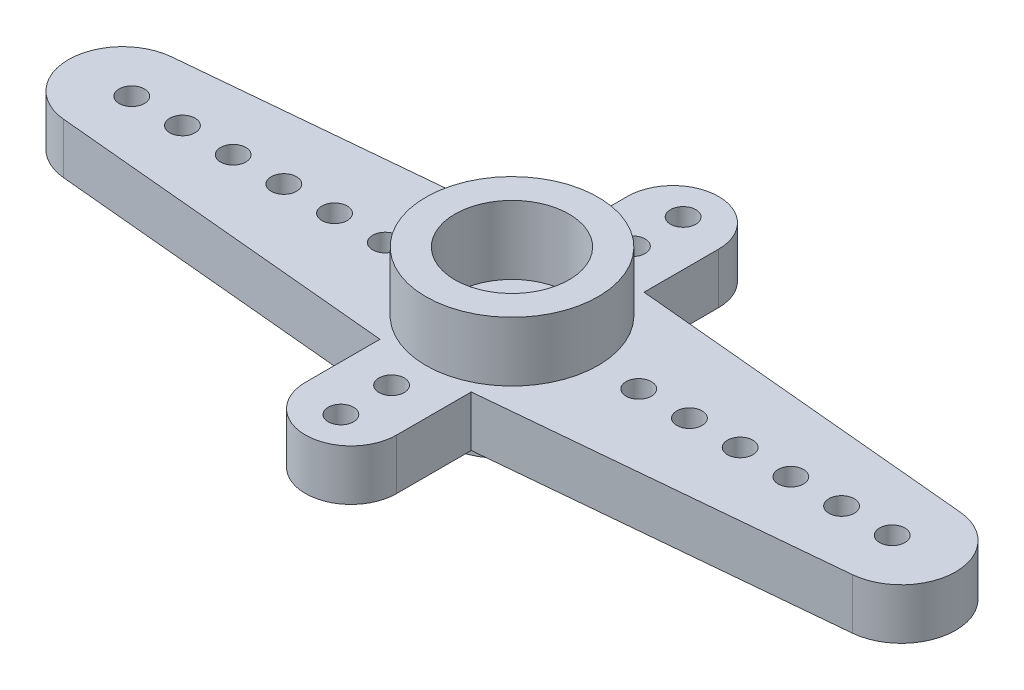
ISO-10303-21;
HEADER;
FILE_DESCRIPTION(('STEP AP214'),'2;1');
FILE_NAME('part.step','',(''),(''),'','','');
FILE_SCHEMA(('AUTOMOTIVE_DESIGN { 1 0 10303 214 1 1 1 1 }'));
ENDSEC;
DATA;
#1=APPLICATION_CONTEXT('core data for automotive mechanical design processes');
#2=APPLICATION_PROTOCOL_DEFINITION('international standard','automotive_design',2000,#1);
#3=PRODUCT_CONTEXT('',#1,'mechanical');
#4=PRODUCT('Part','Part','',(#3));
#5=PRODUCT_RELATED_PRODUCT_CATEGORY('part','',(#4));
#6=PRODUCT_DEFINITION_FORMATION('','',#4);
#7=PRODUCT_DEFINITION_CONTEXT('part definition',#1,'design');
#8=PRODUCT_DEFINITION('design','',#6,#7);
#9=PRODUCT_DEFINITION_SHAPE('','',#8);
#10=(LENGTH_UNIT() NAMED_UNIT(*) SI_UNIT(.MILLI.,.METRE.));
#11=(NAMED_UNIT(*) PLANE_ANGLE_UNIT() SI_UNIT($,.RADIAN.));
#12=(NAMED_UNIT(*) SI_UNIT($,.STERADIAN.) SOLID_ANGLE_UNIT());
#13=UNCERTAINTY_MEASURE_WITH_UNIT(LENGTH_MEASURE(1.E-05),#10,'distance_accuracy_value','');
#14=(GEOMETRIC_REPRESENTATION_CONTEXT(3) GLOBAL_UNCERTAINTY_ASSIGNED_CONTEXT((#13)) GLOBAL_UNIT_ASSIGNED_CONTEXT((#10,
#11,#12)) REPRESENTATION_CONTEXT('',''));
#15=CARTESIAN_POINT('',(0.,0.,0.));
#16=DIRECTION('',(0.,0.,1.));
#17=DIRECTION('',(1.,0.,0.));
#18=AXIS2_PLACEMENT_3D('',#15,#16,#17);
#19=CARTESIAN_POINT('',(0.,4.85,0.));
#20=DIRECTION('',(0.,-1.,0.));
#21=DIRECTION('',(0.,0.,-1.));
#22=AXIS2_PLACEMENT_3D('',#19,#20,#21);
#23=CYLINDRICAL_SURFACE('',#22,2.25);
#24=CARTESIAN_POINT('',(0.,0.,0.));
#25=DIRECTION('',(0.,1.,0.));
#26=DIRECTION('',(0.,0.,1.));
#27=AXIS2_PLACEMENT_3D('',#24,#25,#26);
#28=CIRCLE('',#27,2.25);
#29=CARTESIAN_POINT('',(0.,0.,2.25));
#30=VERTEX_POINT('',#29);
#31=EDGE_CURVE('E213',#30,#30,#28,.T.);
#32=ORIENTED_EDGE('',*,*,#31,.F.);
#33=EDGE_LOOP('',(#32));
#34=FACE_BOUND('',#33,.T.);
#35=CARTESIAN_POINT('',(0.,1.25,0.));
#36=DIRECTION('',(0.,1.,0.));
#37=DIRECTION('',(0.,0.,1.));
#38=AXIS2_PLACEMENT_3D('',#35,#36,#37);
#39=CIRCLE('',#38,2.25);
#40=CARTESIAN_POINT('',(0.,1.25,2.25));
#41=VERTEX_POINT('',#40);
#42=EDGE_CURVE('E239',#41,#41,#39,.T.);
#43=ORIENTED_EDGE('',*,*,#42,.T.);
#44=EDGE_LOOP('',(#43));
#45=FACE_BOUND('',#44,.T.);
#46=ADVANCED_FACE('F34',(#34,#45),#23,.F.);
#47=CARTESIAN_POINT('',(0.,4.85,0.));
#48=DIRECTION('',(0.,-1.,0.));
#49=DIRECTION('',(0.,0.,-1.));
#50=AXIS2_PLACEMENT_3D('',#47,#48,#49);
#51=CYLINDRICAL_SURFACE('',#50,3.4);
#52=CARTESIAN_POINT('',(0.,0.,0.));
#53=DIRECTION('',(0.,1.,0.));
#54=DIRECTION('',(0.,0.,1.));
#55=AXIS2_PLACEMENT_3D('',#52,#53,#54);
#56=CIRCLE('',#55,3.4);
#57=CARTESIAN_POINT('',(0.,0.,3.4));
#58=VERTEX_POINT('',#57);
#59=EDGE_CURVE('E217',#58,#58,#56,.T.);
#60=ORIENTED_EDGE('',*,*,#59,.T.);
#61=EDGE_LOOP('',(#60));
#62=FACE_BOUND('',#61,.T.);
#63=CARTESIAN_POINT('',(0.,0.5,0.));
#64=DIRECTION('',(0.,1.,0.));
#65=DIRECTION('',(0.,0.,1.));
#66=AXIS2_PLACEMENT_3D('',#63,#64,#65);
#67=CIRCLE('',#66,3.4);
#68=CARTESIAN_POINT('',(0.,0.5,3.4));
#69=VERTEX_POINT('',#68);
#70=EDGE_CURVE('E43',#69,#69,#67,.T.);
#71=ORIENTED_EDGE('',*,*,#70,.F.);
#72=EDGE_LOOP('',(#71));
#73=FACE_BOUND('',#72,.T.);
#74=ADVANCED_FACE('F224',(#62,#73),#51,.T.);
#75=CARTESIAN_POINT('',(0.,4.85,0.));
#76=DIRECTION('',(0.,1.,0.));
#77=DIRECTION('',(0.,0.,1.));
#78=AXIS2_PLACEMENT_3D('',#75,#76,#77);
#79=PLANE('',#78);
#80=CARTESIAN_POINT('',(0.,4.85,0.));
#81=DIRECTION('',(0.,1.,0.));
#82=DIRECTION('',(0.,0.,1.));
#83=AXIS2_PLACEMENT_3D('',#80,#81,#82);
#84=CIRCLE('',#83,3.4);
#85=CARTESIAN_POINT('',(0.,4.85,3.4));
#86=VERTEX_POINT('',#85);
#87=EDGE_CURVE('E210',#86,#86,#84,.T.);
#88=ORIENTED_EDGE('',*,*,#87,.T.);
#89=EDGE_LOOP('',(#88));
#90=FACE_BOUND('',#89,.T.);
#91=CARTESIAN_POINT('',(0.,4.85,0.));
#92=DIRECTION('',(0.,1.,0.));
#93=DIRECTION('',(0.,0.,1.));
#94=AXIS2_PLACEMENT_3D('',#91,#92,#93);
#95=CIRCLE('',#94,2.25);
#96=CARTESIAN_POINT('',(0.,4.85,2.25));
#97=VERTEX_POINT('',#96);
#98=EDGE_CURVE('E214',#97,#97,#95,.T.);
#99=ORIENTED_EDGE('',*,*,#98,.F.);
#100=EDGE_LOOP('',(#99));
#101=FACE_BOUND('',#100,.T.);
#102=ADVANCED_FACE('F230',(#90,#101),#79,.T.);
#103=CARTESIAN_POINT('',(0.,0.,0.));
#104=DIRECTION('',(0.,1.,0.));
#105=DIRECTION('',(0.,0.,1.));
#106=AXIS2_PLACEMENT_3D('',#103,#104,#105);
#107=PLANE('',#106);
#108=ORIENTED_EDGE('',*,*,#59,.F.);
#109=EDGE_LOOP('',(#108));
#110=FACE_BOUND('',#109,.T.);
#111=ORIENTED_EDGE('',*,*,#31,.T.);
#112=EDGE_LOOP('',(#111));
#113=FACE_BOUND('',#112,.T.);
#114=ADVANCED_FACE('F227',(#110,#113),#107,.F.);
#115=CARTESIAN_POINT('',(0.,2.5,0.));
#116=DIRECTION('',(0.,1.,0.));
#117=DIRECTION('',(0.,0.,1.));
#118=AXIS2_PLACEMENT_3D('',#115,#116,#117);
#119=CIRCLE('',#118,3.4);
#120=CARTESIAN_POINT('',(0.,2.5,3.4));
#121=VERTEX_POINT('',#120);
#122=EDGE_CURVE('E207',#121,#121,#119,.T.);
#123=ORIENTED_EDGE('',*,*,#122,.T.);
#124=EDGE_LOOP('',(#123));
#125=FACE_BOUND('',#124,.T.);
#126=ORIENTED_EDGE('',*,*,#87,.F.);
#127=EDGE_LOOP('',(#126));
#128=FACE_BOUND('',#127,.T.);
#129=ADVANCED_FACE('F36',(#125,#128),#51,.T.);
#130=CARTESIAN_POINT('',(0.,2.15,0.));
#131=DIRECTION('',(0.,1.,0.));
#132=DIRECTION('',(0.,0.,1.));
#133=AXIS2_PLACEMENT_3D('',#130,#131,#132);
#134=CIRCLE('',#133,2.25);
#135=CARTESIAN_POINT('',(0.,2.15,2.25));
#136=VERTEX_POINT('',#135);
#137=EDGE_CURVE('E11',#136,#136,#134,.T.);
#138=ORIENTED_EDGE('',*,*,#137,.F.);
#139=EDGE_LOOP('',(#138));
#140=FACE_BOUND('',#139,.T.);
#141=ORIENTED_EDGE('',*,*,#98,.T.);
#142=EDGE_LOOP('',(#141));
#143=FACE_BOUND('',#142,.T.);
#144=ADVANCED_FACE('F236',(#140,#143),#23,.F.);
#145=CARTESIAN_POINT('',(-1.22162409223594E-11,2.5,-6.35));
#146=DIRECTION('',(0.,1.,0.));
#147=DIRECTION('',(0.,0.,1.));
#148=AXIS2_PLACEMENT_3D('',#145,#146,#147);
#149=PLANE('',#148);
#150=CARTESIAN_POINT('',(-15.,2.5,0.));
#151=DIRECTION('',(0.,1.,0.));
#152=DIRECTION('',(0.,0.,1.));
#153=AXIS2_PLACEMENT_3D('',#150,#151,#152);
#154=CIRCLE('',#153,0.500000000000001);
#155=CARTESIAN_POINT('',(-15.,2.5,0.500000000000001));
#156=VERTEX_POINT('',#155);
#157=EDGE_CURVE('E245',#156,#156,#154,.T.);
#158=ORIENTED_EDGE('',*,*,#157,.F.);
#159=EDGE_LOOP('',(#158));
#160=FACE_BOUND('',#159,.T.);
#161=CARTESIAN_POINT('',(-11.,2.5,0.));
#162=DIRECTION('',(0.,1.,0.));
#163=DIRECTION('',(0.,0.,1.));
#164=AXIS2_PLACEMENT_3D('',#161,#162,#163);
#165=CIRCLE('',#164,0.500000000000001);
#166=CARTESIAN_POINT('',(-11.,2.5,0.500000000000001));
#167=VERTEX_POINT('',#166);
#168=EDGE_CURVE('E261',#167,#167,#165,.T.);
#169=ORIENTED_EDGE('',*,*,#168,.F.);
#170=EDGE_LOOP('',(#169));
#171=FACE_BOUND('',#170,.T.);
#172=CARTESIAN_POINT('',(-7.,2.5,0.));
#173=DIRECTION('',(0.,1.,0.));
#174=DIRECTION('',(0.,0.,1.));
#175=AXIS2_PLACEMENT_3D('',#172,#173,#174);
#176=CIRCLE('',#175,0.5);
#177=CARTESIAN_POINT('',(-7.,2.5,0.5));
#178=VERTEX_POINT('',#177);
#179=EDGE_CURVE('E273',#178,#178,#176,.T.);
#180=ORIENTED_EDGE('',*,*,#179,.F.);
#181=EDGE_LOOP('',(#180));
#182=FACE_BOUND('',#181,.T.);
#183=CARTESIAN_POINT('',(0.,2.5,-4.75));
#184=DIRECTION('',(0.,1.,0.));
#185=DIRECTION('',(0.,0.,1.));
#186=AXIS2_PLACEMENT_3D('',#183,#184,#185);
#187=CIRCLE('',#186,0.500000000000001);
#188=CARTESIAN_POINT('',(0.,2.5,-4.25));
#189=VERTEX_POINT('',#188);
#190=EDGE_CURVE('E285',#189,#189,#187,.T.);
#191=ORIENTED_EDGE('',*,*,#190,.F.);
#192=EDGE_LOOP('',(#191));
#193=FACE_BOUND('',#192,.T.);
#194=CARTESIAN_POINT('',(5.,2.5,0.));
#195=DIRECTION('',(0.,1.,0.));
#196=DIRECTION('',(0.,0.,1.));
#197=AXIS2_PLACEMENT_3D('',#194,#195,#196);
#198=CIRCLE('',#197,0.5);
#199=CARTESIAN_POINT('',(5.,2.5,0.5));
#200=VERTEX_POINT('',#199);
#201=EDGE_CURVE('E297',#200,#200,#198,.T.);
#202=ORIENTED_EDGE('',*,*,#201,.F.);
#203=EDGE_LOOP('',(#202));
#204=FACE_BOUND('',#203,.T.);
#205=CARTESIAN_POINT('',(9.,2.5,0.));
#206=DIRECTION('',(0.,1.,0.));
#207=DIRECTION('',(0.,0.,1.));
#208=AXIS2_PLACEMENT_3D('',#205,#206,#207);
#209=CIRCLE('',#208,0.500000000000001);
#210=CARTESIAN_POINT('',(9.,2.5,0.500000000000001));
#211=VERTEX_POINT('',#210);
#212=EDGE_CURVE('E309',#211,#211,#209,.T.);
#213=ORIENTED_EDGE('',*,*,#212,.F.);
#214=EDGE_LOOP('',(#213));
#215=FACE_BOUND('',#214,.T.);
#216=CARTESIAN_POINT('',(13.,2.5,0.));
#217=DIRECTION('',(0.,1.,0.));
#218=DIRECTION('',(0.,0.,1.));
#219=AXIS2_PLACEMENT_3D('',#216,#217,#218);
#220=CIRCLE('',#219,0.500000000000001);
#221=CARTESIAN_POINT('',(13.,2.5,0.500000000000001));
#222=VERTEX_POINT('',#221);
#223=EDGE_CURVE('E321',#222,#222,#220,.T.);
#224=ORIENTED_EDGE('',*,*,#223,.F.);
#225=EDGE_LOOP('',(#224));
#226=FACE_BOUND('',#225,.T.);
#227=CARTESIAN_POINT('',(0.,2.5,4.75));
#228=DIRECTION('',(0.,1.,0.));
#229=DIRECTION('',(0.,0.,1.));
#230=AXIS2_PLACEMENT_3D('',#227,#228,#229);
#231=CIRCLE('',#230,0.499999999999999);
#232=CARTESIAN_POINT('',(0.,2.5,5.25));
#233=VERTEX_POINT('',#232);
#234=EDGE_CURVE('E333',#233,#233,#231,.T.);
#235=ORIENTED_EDGE('',*,*,#234,.F.);
#236=EDGE_LOOP('',(#235));
#237=FACE_BOUND('',#236,.T.);
#238=DIRECTION('',(-0.995716456663753,0.,-0.0924593852942015));
#239=VECTOR('',#238,1.);
#240=CARTESIAN_POINT('',(15.5583529092808,2.5,-2.13029580097279));
#241=LINE('',#240,#239);
#242=CARTESIAN_POINT('',(15.5583529092808,2.5,-2.13029580097279));
#243=VERTEX_POINT('',#242);
#244=CARTESIAN_POINT('',(1.79999999164778,2.5,-3.40785714377443));
#245=VERTEX_POINT('',#244);
#246=EDGE_CURVE('E180',#243,#245,#241,.T.);
#247=ORIENTED_EDGE('',*,*,#246,.T.);
#248=DIRECTION('',(0.,0.,-1.));
#249=VECTOR('',#248,1.);
#250=CARTESIAN_POINT('',(1.79999999164778,2.5,-3.40785714377443));
#251=LINE('',#250,#249);
#252=CARTESIAN_POINT('',(1.79999999164778,2.5,-6.35));
#253=VERTEX_POINT('',#252);
#254=EDGE_CURVE('E107',#245,#253,#251,.T.);
#255=ORIENTED_EDGE('',*,*,#254,.T.);
#256=CARTESIAN_POINT('',(-1.22162409223594E-11,2.5,-6.35));
#257=DIRECTION('',(0.,1.,0.));
#258=DIRECTION('',(0.,0.,1.));
#259=AXIS2_PLACEMENT_3D('',#256,#257,#258);
#260=CIRCLE('',#259,1.79999999166);
#261=CARTESIAN_POINT('',(-1.79999999167222,2.5,-6.34999999965378));
#262=VERTEX_POINT('',#261);
#263=EDGE_CURVE('E345',#253,#262,#260,.T.);
#264=ORIENTED_EDGE('',*,*,#263,.T.);
#265=DIRECTION('',(0.,0.,1.));
#266=VECTOR('',#265,1.);
#267=CARTESIAN_POINT('',(-1.79999999167222,2.5,-6.34999999965378));
#268=LINE('',#267,#266);
#269=CARTESIAN_POINT('',(-1.79999999167222,2.5,-3.40785714377443));
#270=VERTEX_POINT('',#269);
#271=EDGE_CURVE('E347',#262,#270,#268,.T.);
#272=ORIENTED_EDGE('',*,*,#271,.T.);
#273=DIRECTION('',(-0.995716456663753,0.,0.0924593852942015));
#274=VECTOR('',#273,1.);
#275=CARTESIAN_POINT('',(-1.79999999167222,2.5,-3.40785714377443));
#276=LINE('',#275,#274);
#277=CARTESIAN_POINT('',(-15.5583529093052,2.5,-2.13029580097279));
#278=VERTEX_POINT('',#277);
#279=EDGE_CURVE('E349',#270,#278,#276,.T.);
#280=ORIENTED_EDGE('',*,*,#279,.T.);
#281=CARTESIAN_POINT('',(-15.3605397280061,2.5,6.57820152516475E-11));
#282=DIRECTION('',(0.,1.,0.));
#283=DIRECTION('',(0.,0.,1.));
#284=AXIS2_PLACEMENT_3D('',#281,#282,#283);
#285=CIRCLE('',#284,2.13946027180181);
#286=CARTESIAN_POINT('',(-15.5583529091405,2.5,2.13029580111965));
#287=VERTEX_POINT('',#286);
#288=EDGE_CURVE('E351',#278,#287,#285,.T.);
#289=ORIENTED_EDGE('',*,*,#288,.T.);
#290=DIRECTION('',(0.995716456664637,0.,0.09245938528468));
#291=VECTOR('',#290,1.);
#292=CARTESIAN_POINT('',(-15.5583529091405,2.5,2.13029580111965));
#293=LINE('',#292,#291);
#294=CARTESIAN_POINT('',(-1.79999999166,2.5,3.40785714377443));
#295=VERTEX_POINT('',#294);
#296=EDGE_CURVE('E353',#287,#295,#293,.T.);
#297=ORIENTED_EDGE('',*,*,#296,.T.);
#298=DIRECTION('',(0.,0.,1.));
#299=VECTOR('',#298,1.);
#300=CARTESIAN_POINT('',(-1.79999999166,2.5,3.40785714377443));
#301=LINE('',#300,#299);
#302=CARTESIAN_POINT('',(-1.79999999166,2.5,6.35));
#303=VERTEX_POINT('',#302);
#304=EDGE_CURVE('E355',#295,#303,#301,.T.);
#305=ORIENTED_EDGE('',*,*,#304,.T.);
#306=CARTESIAN_POINT('',(0.,2.5,6.35));
#307=DIRECTION('',(0.,1.,0.));
#308=DIRECTION('',(0.,0.,1.));
#309=AXIS2_PLACEMENT_3D('',#306,#307,#308);
#310=CIRCLE('',#309,1.79999999166);
#311=CARTESIAN_POINT('',(1.79999999166,2.5,6.35000000018459));
#312=VERTEX_POINT('',#311);
#313=EDGE_CURVE('E139',#303,#312,#310,.T.);
#314=ORIENTED_EDGE('',*,*,#313,.T.);
#315=DIRECTION('',(0.,0.,-1.));
#316=VECTOR('',#315,1.);
#317=CARTESIAN_POINT('',(1.79999999166,2.5,6.35000000018459));
#318=LINE('',#317,#316);
#319=CARTESIAN_POINT('',(1.79999999166,2.5,3.40785714377443));
#320=VERTEX_POINT('',#319);
#321=EDGE_CURVE('E132',#312,#320,#318,.T.);
#322=ORIENTED_EDGE('',*,*,#321,.T.);
#323=DIRECTION('',(0.995716456663753,0.,-0.0924593852942015));
#324=VECTOR('',#323,1.);
#325=CARTESIAN_POINT('',(1.79999999166,2.5,3.40785714377443));
#326=LINE('',#325,#324);
#327=CARTESIAN_POINT('',(15.558352909293,2.5,2.13029580097279));
#328=VERTEX_POINT('',#327);
#329=EDGE_CURVE('E137',#320,#328,#326,.T.);
#330=ORIENTED_EDGE('',*,*,#329,.T.);
#331=CARTESIAN_POINT('',(15.3605397279939,2.5,5.66950999388482E-13));
#332=DIRECTION('',(0.,1.,0.));
#333=DIRECTION('',(0.,0.,1.));
#334=AXIS2_PLACEMENT_3D('',#331,#332,#333);
#335=CIRCLE('',#334,2.13946027173574);
#336=EDGE_CURVE('E51',#328,#243,#335,.T.);
#337=ORIENTED_EDGE('',*,*,#336,.T.);
#338=EDGE_LOOP('',(#247,#255,#264,#272,#280,#289,#297,#305,#314,#322,#330,#337));
#339=FACE_BOUND('',#338,.T.);
#340=CARTESIAN_POINT('',(0.,2.5,6.75));
#341=DIRECTION('',(0.,1.,0.));
#342=DIRECTION('',(0.,0.,1.));
#343=AXIS2_PLACEMENT_3D('',#340,#341,#342);
#344=CIRCLE('',#343,0.500000000000001);
#345=CARTESIAN_POINT('',(0.,2.5,7.25));
#346=VERTEX_POINT('',#345);
#347=EDGE_CURVE('E161',#346,#346,#344,.T.);
#348=ORIENTED_EDGE('',*,*,#347,.F.);
#349=EDGE_LOOP('',(#348));
#350=FACE_BOUND('',#349,.T.);
#351=CARTESIAN_POINT('',(15.,2.5,0.));
#352=DIRECTION('',(0.,1.,0.));
#353=DIRECTION('',(0.,0.,1.));
#354=AXIS2_PLACEMENT_3D('',#351,#352,#353);
#355=CIRCLE('',#354,0.499999999999999);
#356=CARTESIAN_POINT('',(15.,2.5,0.499999999999999));
#357=VERTEX_POINT('',#356);
#358=EDGE_CURVE('E327',#357,#357,#355,.T.);
#359=ORIENTED_EDGE('',*,*,#358,.F.);
#360=EDGE_LOOP('',(#359));
#361=FACE_BOUND('',#360,.T.);
#362=CARTESIAN_POINT('',(11.,2.5,0.));
#363=DIRECTION('',(0.,1.,0.));
#364=DIRECTION('',(0.,0.,1.));
#365=AXIS2_PLACEMENT_3D('',#362,#363,#364);
#366=CIRCLE('',#365,0.500000000000001);
#367=CARTESIAN_POINT('',(11.,2.5,0.500000000000001));
#368=VERTEX_POINT('',#367);
#369=EDGE_CURVE('E315',#368,#368,#366,.T.);
#370=ORIENTED_EDGE('',*,*,#369,.F.);
#371=EDGE_LOOP('',(#370));
#372=FACE_BOUND('',#371,.T.);
#373=CARTESIAN_POINT('',(7.,2.5,0.));
#374=DIRECTION('',(0.,1.,0.));
#375=DIRECTION('',(0.,0.,1.));
#376=AXIS2_PLACEMENT_3D('',#373,#374,#375);
#377=CIRCLE('',#376,0.5);
#378=CARTESIAN_POINT('',(7.,2.5,0.5));
#379=VERTEX_POINT('',#378);
#380=EDGE_CURVE('E303',#379,#379,#377,.T.);
#381=ORIENTED_EDGE('',*,*,#380,.F.);
#382=EDGE_LOOP('',(#381));
#383=FACE_BOUND('',#382,.T.);
#384=CARTESIAN_POINT('',(0.,2.5,-6.75));
#385=DIRECTION('',(0.,1.,0.));
#386=DIRECTION('',(0.,0.,1.));
#387=AXIS2_PLACEMENT_3D('',#384,#385,#386);
#388=CIRCLE('',#387,0.499999999999999);
#389=CARTESIAN_POINT('',(0.,2.5,-6.25));
#390=VERTEX_POINT('',#389);
#391=EDGE_CURVE('E291',#390,#390,#388,.T.);
#392=ORIENTED_EDGE('',*,*,#391,.F.);
#393=EDGE_LOOP('',(#392));
#394=FACE_BOUND('',#393,.T.);
#395=CARTESIAN_POINT('',(-5.,2.5,0.));
#396=DIRECTION('',(0.,1.,0.));
#397=DIRECTION('',(0.,0.,1.));
#398=AXIS2_PLACEMENT_3D('',#395,#396,#397);
#399=CIRCLE('',#398,0.5);
#400=CARTESIAN_POINT('',(-5.,2.5,0.5));
#401=VERTEX_POINT('',#400);
#402=EDGE_CURVE('E279',#401,#401,#399,.T.);
#403=ORIENTED_EDGE('',*,*,#402,.F.);
#404=EDGE_LOOP('',(#403));
#405=FACE_BOUND('',#404,.T.);
#406=CARTESIAN_POINT('',(-9.,2.5,0.));
#407=DIRECTION('',(0.,1.,0.));
#408=DIRECTION('',(0.,0.,1.));
#409=AXIS2_PLACEMENT_3D('',#406,#407,#408);
#410=CIRCLE('',#409,0.500000000000001);
#411=CARTESIAN_POINT('',(-9.,2.5,0.500000000000001));
#412=VERTEX_POINT('',#411);
#413=EDGE_CURVE('E267',#412,#412,#410,.T.);
#414=ORIENTED_EDGE('',*,*,#413,.F.);
#415=EDGE_LOOP('',(#414));
#416=FACE_BOUND('',#415,.T.);
#417=CARTESIAN_POINT('',(-13.,2.5,0.));
#418=DIRECTION('',(0.,1.,0.));
#419=DIRECTION('',(0.,0.,1.));
#420=AXIS2_PLACEMENT_3D('',#417,#418,#419);
#421=CIRCLE('',#420,0.500000000000001);
#422=CARTESIAN_POINT('',(-13.,2.5,0.500000000000001));
#423=VERTEX_POINT('',#422);
#424=EDGE_CURVE('E255',#423,#423,#421,.T.);
#425=ORIENTED_EDGE('',*,*,#424,.F.);
#426=EDGE_LOOP('',(#425));
#427=FACE_BOUND('',#426,.T.);
#428=ORIENTED_EDGE('',*,*,#122,.F.);
#429=EDGE_LOOP('',(#428));
#430=FACE_BOUND('',#429,.T.);
#431=ADVANCED_FACE('F134',(#160,#171,#182,#193,#204,#215,#226,#237,#339,#350,#361,#372,#383,
#394,#405,#416,#427,#430),#149,.T.);
#432=CARTESIAN_POINT('',(-1.22162409223594E-11,0.5,-6.35));
#433=DIRECTION('',(0.,1.,0.));
#434=DIRECTION('',(0.,0.,1.));
#435=AXIS2_PLACEMENT_3D('',#432,#433,#434);
#436=PLANE('',#435);
#437=CARTESIAN_POINT('',(-15.,0.5,0.));
#438=DIRECTION('',(0.,1.,0.));
#439=DIRECTION('',(0.,0.,1.));
#440=AXIS2_PLACEMENT_3D('',#437,#438,#439);
#441=CIRCLE('',#440,0.500000000000001);
#442=CARTESIAN_POINT('',(-15.,0.5,0.500000000000001));
#443=VERTEX_POINT('',#442);
#444=EDGE_CURVE('E241',#443,#443,#441,.T.);
#445=ORIENTED_EDGE('',*,*,#444,.T.);
#446=EDGE_LOOP('',(#445));
#447=FACE_BOUND('',#446,.T.);
#448=CARTESIAN_POINT('',(-13.,0.5,0.));
#449=DIRECTION('',(0.,1.,0.));
#450=DIRECTION('',(0.,0.,1.));
#451=AXIS2_PLACEMENT_3D('',#448,#449,#450);
#452=CIRCLE('',#451,0.500000000000001);
#453=CARTESIAN_POINT('',(-13.,0.5,0.500000000000001));
#454=VERTEX_POINT('',#453);
#455=EDGE_CURVE('E253',#454,#454,#452,.T.);
#456=ORIENTED_EDGE('',*,*,#455,.T.);
#457=EDGE_LOOP('',(#456));
#458=FACE_BOUND('',#457,.T.);
#459=CARTESIAN_POINT('',(-11.,0.5,0.));
#460=DIRECTION('',(0.,1.,0.));
#461=DIRECTION('',(0.,0.,1.));
#462=AXIS2_PLACEMENT_3D('',#459,#460,#461);
#463=CIRCLE('',#462,0.500000000000001);
#464=CARTESIAN_POINT('',(-11.,0.5,0.500000000000001));
#465=VERTEX_POINT('',#464);
#466=EDGE_CURVE('E258',#465,#465,#463,.T.);
#467=ORIENTED_EDGE('',*,*,#466,.T.);
#468=EDGE_LOOP('',(#467));
#469=FACE_BOUND('',#468,.T.);
#470=CARTESIAN_POINT('',(-9.,0.5,0.));
#471=DIRECTION('',(0.,1.,0.));
#472=DIRECTION('',(0.,0.,1.));
#473=AXIS2_PLACEMENT_3D('',#470,#471,#472);
#474=CIRCLE('',#473,0.500000000000001);
#475=CARTESIAN_POINT('',(-9.,0.5,0.500000000000001));
#476=VERTEX_POINT('',#475);
#477=EDGE_CURVE('E264',#476,#476,#474,.T.);
#478=ORIENTED_EDGE('',*,*,#477,.T.);
#479=EDGE_LOOP('',(#478));
#480=FACE_BOUND('',#479,.T.);
#481=CARTESIAN_POINT('',(-7.,0.5,0.));
#482=DIRECTION('',(0.,1.,0.));
#483=DIRECTION('',(0.,0.,1.));
#484=AXIS2_PLACEMENT_3D('',#481,#482,#483);
#485=CIRCLE('',#484,0.5);
#486=CARTESIAN_POINT('',(-7.,0.5,0.5));
#487=VERTEX_POINT('',#486);
#488=EDGE_CURVE('E270',#487,#487,#485,.T.);
#489=ORIENTED_EDGE('',*,*,#488,.T.);
#490=EDGE_LOOP('',(#489));
#491=FACE_BOUND('',#490,.T.);
#492=CARTESIAN_POINT('',(-5.,0.5,0.));
#493=DIRECTION('',(0.,1.,0.));
#494=DIRECTION('',(0.,0.,1.));
#495=AXIS2_PLACEMENT_3D('',#492,#493,#494);
#496=CIRCLE('',#495,0.5);
#497=CARTESIAN_POINT('',(-5.,0.5,0.5));
#498=VERTEX_POINT('',#497);
#499=EDGE_CURVE('E276',#498,#498,#496,.T.);
#500=ORIENTED_EDGE('',*,*,#499,.T.);
#501=EDGE_LOOP('',(#500));
#502=FACE_BOUND('',#501,.T.);
#503=CARTESIAN_POINT('',(0.,0.5,-4.75));
#504=DIRECTION('',(0.,1.,0.));
#505=DIRECTION('',(0.,0.,1.));
#506=AXIS2_PLACEMENT_3D('',#503,#504,#505);
#507=CIRCLE('',#506,0.500000000000001);
#508=CARTESIAN_POINT('',(0.,0.5,-4.25));
#509=VERTEX_POINT('',#508);
#510=EDGE_CURVE('E282',#509,#509,#507,.T.);
#511=ORIENTED_EDGE('',*,*,#510,.T.);
#512=EDGE_LOOP('',(#511));
#513=FACE_BOUND('',#512,.T.);
#514=CARTESIAN_POINT('',(0.,0.5,-6.75));
#515=DIRECTION('',(0.,1.,0.));
#516=DIRECTION('',(0.,0.,1.));
#517=AXIS2_PLACEMENT_3D('',#514,#515,#516);
#518=CIRCLE('',#517,0.499999999999999);
#519=CARTESIAN_POINT('',(0.,0.5,-6.25));
#520=VERTEX_POINT('',#519);
#521=EDGE_CURVE('E288',#520,#520,#518,.T.);
#522=ORIENTED_EDGE('',*,*,#521,.T.);
#523=EDGE_LOOP('',(#522));
#524=FACE_BOUND('',#523,.T.);
#525=CARTESIAN_POINT('',(5.,0.5,0.));
#526=DIRECTION('',(0.,1.,0.));
#527=DIRECTION('',(0.,0.,1.));
#528=AXIS2_PLACEMENT_3D('',#525,#526,#527);
#529=CIRCLE('',#528,0.5);
#530=CARTESIAN_POINT('',(5.,0.5,0.5));
#531=VERTEX_POINT('',#530);
#532=EDGE_CURVE('E294',#531,#531,#529,.T.);
#533=ORIENTED_EDGE('',*,*,#532,.T.);
#534=EDGE_LOOP('',(#533));
#535=FACE_BOUND('',#534,.T.);
#536=CARTESIAN_POINT('',(7.,0.5,0.));
#537=DIRECTION('',(0.,1.,0.));
#538=DIRECTION('',(0.,0.,1.));
#539=AXIS2_PLACEMENT_3D('',#536,#537,#538);
#540=CIRCLE('',#539,0.5);
#541=CARTESIAN_POINT('',(7.,0.5,0.5));
#542=VERTEX_POINT('',#541);
#543=EDGE_CURVE('E300',#542,#542,#540,.T.);
#544=ORIENTED_EDGE('',*,*,#543,.T.);
#545=EDGE_LOOP('',(#544));
#546=FACE_BOUND('',#545,.T.);
#547=CARTESIAN_POINT('',(9.,0.5,0.));
#548=DIRECTION('',(0.,1.,0.));
#549=DIRECTION('',(0.,0.,1.));
#550=AXIS2_PLACEMENT_3D('',#547,#548,#549);
#551=CIRCLE('',#550,0.500000000000001);
#552=CARTESIAN_POINT('',(9.,0.5,0.500000000000001));
#553=VERTEX_POINT('',#552);
#554=EDGE_CURVE('E306',#553,#553,#551,.T.);
#555=ORIENTED_EDGE('',*,*,#554,.T.);
#556=EDGE_LOOP('',(#555));
#557=FACE_BOUND('',#556,.T.);
#558=CARTESIAN_POINT('',(11.,0.5,0.));
#559=DIRECTION('',(0.,1.,0.));
#560=DIRECTION('',(0.,0.,1.));
#561=AXIS2_PLACEMENT_3D('',#558,#559,#560);
#562=CIRCLE('',#561,0.500000000000001);
#563=CARTESIAN_POINT('',(11.,0.5,0.500000000000001));
#564=VERTEX_POINT('',#563);
#565=EDGE_CURVE('E312',#564,#564,#562,.T.);
#566=ORIENTED_EDGE('',*,*,#565,.T.);
#567=EDGE_LOOP('',(#566));
#568=FACE_BOUND('',#567,.T.);
#569=CARTESIAN_POINT('',(13.,0.5,0.));
#570=DIRECTION('',(0.,1.,0.));
#571=DIRECTION('',(0.,0.,1.));
#572=AXIS2_PLACEMENT_3D('',#569,#570,#571);
#573=CIRCLE('',#572,0.500000000000001);
#574=CARTESIAN_POINT('',(13.,0.5,0.500000000000001));
#575=VERTEX_POINT('',#574);
#576=EDGE_CURVE('E318',#575,#575,#573,.T.);
#577=ORIENTED_EDGE('',*,*,#576,.T.);
#578=EDGE_LOOP('',(#577));
#579=FACE_BOUND('',#578,.T.);
#580=CARTESIAN_POINT('',(15.,0.5,0.));
#581=DIRECTION('',(0.,1.,0.));
#582=DIRECTION('',(0.,0.,1.));
#583=AXIS2_PLACEMENT_3D('',#580,#581,#582);
#584=CIRCLE('',#583,0.499999999999999);
#585=CARTESIAN_POINT('',(15.,0.5,0.499999999999999));
#586=VERTEX_POINT('',#585);
#587=EDGE_CURVE('E324',#586,#586,#584,.T.);
#588=ORIENTED_EDGE('',*,*,#587,.T.);
#589=EDGE_LOOP('',(#588));
#590=FACE_BOUND('',#589,.T.);
#591=CARTESIAN_POINT('',(0.,0.5,4.75));
#592=DIRECTION('',(0.,1.,0.));
#593=DIRECTION('',(0.,0.,1.));
#594=AXIS2_PLACEMENT_3D('',#591,#592,#593);
#595=CIRCLE('',#594,0.499999999999999);
#596=CARTESIAN_POINT('',(0.,0.5,5.25));
#597=VERTEX_POINT('',#596);
#598=EDGE_CURVE('E330',#597,#597,#595,.T.);
#599=ORIENTED_EDGE('',*,*,#598,.T.);
#600=EDGE_LOOP('',(#599));
#601=FACE_BOUND('',#600,.T.);
#602=CARTESIAN_POINT('',(0.,0.5,6.75));
#603=DIRECTION('',(0.,1.,0.));
#604=DIRECTION('',(0.,0.,1.));
#605=AXIS2_PLACEMENT_3D('',#602,#603,#604);
#606=CIRCLE('',#605,0.500000000000001);
#607=CARTESIAN_POINT('',(0.,0.5,7.25));
#608=VERTEX_POINT('',#607);
#609=EDGE_CURVE('E336',#608,#608,#606,.T.);
#610=ORIENTED_EDGE('',*,*,#609,.T.);
#611=EDGE_LOOP('',(#610));
#612=FACE_BOUND('',#611,.T.);
#613=DIRECTION('',(-0.995716456663753,0.,-0.0924593852942015));
#614=VECTOR('',#613,1.);
#615=CARTESIAN_POINT('',(15.5583529092808,0.5,-2.13029580097279));
#616=LINE('',#615,#614);
#617=CARTESIAN_POINT('',(15.5583529092808,0.5,-2.13029580097279));
#618=VERTEX_POINT('',#617);
#619=CARTESIAN_POINT('',(1.79999999164778,0.5,-3.40785714377443));
#620=VERTEX_POINT('',#619);
#621=EDGE_CURVE('E157',#618,#620,#616,.T.);
#622=ORIENTED_EDGE('',*,*,#621,.F.);
#623=CARTESIAN_POINT('',(15.3605397279939,0.5,5.66950999388482E-13));
#624=DIRECTION('',(0.,1.,0.));
#625=DIRECTION('',(0.,0.,1.));
#626=AXIS2_PLACEMENT_3D('',#623,#624,#625);
#627=CIRCLE('',#626,2.13946027173574);
#628=CARTESIAN_POINT('',(15.558352909293,0.5,2.13029580097279));
#629=VERTEX_POINT('',#628);
#630=EDGE_CURVE('E98',#629,#618,#627,.T.);
#631=ORIENTED_EDGE('',*,*,#630,.F.);
#632=DIRECTION('',(0.995716456663753,0.,-0.0924593852942015));
#633=VECTOR('',#632,1.);
#634=CARTESIAN_POINT('',(1.79999999166,0.5,3.40785714377443));
#635=LINE('',#634,#633);
#636=CARTESIAN_POINT('',(1.79999999166,0.5,3.40785714377443));
#637=VERTEX_POINT('',#636);
#638=EDGE_CURVE('E92',#637,#629,#635,.T.);
#639=ORIENTED_EDGE('',*,*,#638,.F.);
#640=DIRECTION('',(0.,0.,-1.));
#641=VECTOR('',#640,1.);
#642=CARTESIAN_POINT('',(1.79999999166,0.5,6.35000000018459));
#643=LINE('',#642,#641);
#644=CARTESIAN_POINT('',(1.79999999166,0.5,6.35000000018459));
#645=VERTEX_POINT('',#644);
#646=EDGE_CURVE('E147',#645,#637,#643,.T.);
#647=ORIENTED_EDGE('',*,*,#646,.F.);
#648=CARTESIAN_POINT('',(0.,0.5,6.35));
#649=DIRECTION('',(0.,1.,0.));
#650=DIRECTION('',(0.,0.,1.));
#651=AXIS2_PLACEMENT_3D('',#648,#649,#650);
#652=CIRCLE('',#651,1.79999999166);
#653=CARTESIAN_POINT('',(-1.79999999166,0.5,6.35));
#654=VERTEX_POINT('',#653);
#655=EDGE_CURVE('E175',#654,#645,#652,.T.);
#656=ORIENTED_EDGE('',*,*,#655,.F.);
#657=DIRECTION('',(0.,0.,1.));
#658=VECTOR('',#657,1.);
#659=CARTESIAN_POINT('',(-1.79999999166,0.5,3.40785714377443));
#660=LINE('',#659,#658);
#661=CARTESIAN_POINT('',(-1.79999999166,0.5,3.40785714377443));
#662=VERTEX_POINT('',#661);
#663=EDGE_CURVE('E173',#662,#654,#660,.T.);
#664=ORIENTED_EDGE('',*,*,#663,.F.);
#665=DIRECTION('',(0.995716456664637,0.,0.09245938528468));
#666=VECTOR('',#665,1.);
#667=CARTESIAN_POINT('',(-15.5583529091405,0.5,2.13029580111965));
#668=LINE('',#667,#666);
#669=CARTESIAN_POINT('',(-15.5583529091405,0.5,2.13029580111965));
#670=VERTEX_POINT('',#669);
#671=EDGE_CURVE('E171',#670,#662,#668,.T.);
#672=ORIENTED_EDGE('',*,*,#671,.F.);
#673=CARTESIAN_POINT('',(-15.3605397280061,0.5,6.57820152516475E-11));
#674=DIRECTION('',(0.,1.,0.));
#675=DIRECTION('',(0.,0.,1.));
#676=AXIS2_PLACEMENT_3D('',#673,#674,#675);
#677=CIRCLE('',#676,2.13946027180181);
#678=CARTESIAN_POINT('',(-15.5583529093052,0.5,-2.13029580097279));
#679=VERTEX_POINT('',#678);
#680=EDGE_CURVE('E169',#679,#670,#677,.T.);
#681=ORIENTED_EDGE('',*,*,#680,.F.);
#682=DIRECTION('',(-0.995716456663753,0.,0.0924593852942015));
#683=VECTOR('',#682,1.);
#684=CARTESIAN_POINT('',(-1.79999999167222,0.5,-3.40785714377443));
#685=LINE('',#684,#683);
#686=CARTESIAN_POINT('',(-1.79999999167222,0.5,-3.40785714377443));
#687=VERTEX_POINT('',#686);
#688=EDGE_CURVE('E167',#687,#679,#685,.T.);
#689=ORIENTED_EDGE('',*,*,#688,.F.);
#690=DIRECTION('',(0.,0.,1.));
#691=VECTOR('',#690,1.);
#692=CARTESIAN_POINT('',(-1.79999999167222,0.5,-6.34999999965378));
#693=LINE('',#692,#691);
#694=CARTESIAN_POINT('',(-1.79999999167222,0.5,-6.34999999965378));
#695=VERTEX_POINT('',#694);
#696=EDGE_CURVE('E165',#695,#687,#693,.T.);
#697=ORIENTED_EDGE('',*,*,#696,.F.);
#698=CARTESIAN_POINT('',(-1.22162409223594E-11,0.5,-6.35));
#699=DIRECTION('',(0.,1.,0.));
#700=DIRECTION('',(0.,0.,1.));
#701=AXIS2_PLACEMENT_3D('',#698,#699,#700);
#702=CIRCLE('',#701,1.79999999166);
#703=CARTESIAN_POINT('',(1.79999999164778,0.5,-6.35));
#704=VERTEX_POINT('',#703);
#705=EDGE_CURVE('E163',#704,#695,#702,.T.);
#706=ORIENTED_EDGE('',*,*,#705,.F.);
#707=DIRECTION('',(0.,0.,-1.));
#708=VECTOR('',#707,1.);
#709=CARTESIAN_POINT('',(1.79999999164778,0.5,-3.40785714377443));
#710=LINE('',#709,#708);
#711=EDGE_CURVE('E160',#620,#704,#710,.T.);
#712=ORIENTED_EDGE('',*,*,#711,.F.);
#713=EDGE_LOOP('',(#622,#631,#639,#647,#656,#664,#672,#681,#689,#697,#706,#712));
#714=FACE_BOUND('',#713,.T.);
#715=ORIENTED_EDGE('',*,*,#70,.T.);
#716=EDGE_LOOP('',(#715));
#717=FACE_BOUND('',#716,.T.);
#718=ADVANCED_FACE('F368',(#447,#458,#469,#480,#491,#502,#513,#524,#535,#546,#557,#568,#579,
#590,#601,#612,#714,#717),#436,.F.);
#719=CARTESIAN_POINT('',(15.5583529092808,2.5,-2.13029580097279));
#720=DIRECTION('',(-0.0924593852942014,0.,0.995716456663752));
#721=DIRECTION('',(0.995716456663753,0.,0.0924593852942015));
#722=AXIS2_PLACEMENT_3D('',#719,#720,#721);
#723=PLANE('',#722);
#724=ORIENTED_EDGE('',*,*,#621,.T.);
#725=DIRECTION('',(0.,-1.,0.));
#726=VECTOR('',#725,1.);
#727=CARTESIAN_POINT('',(1.79999999164778,2.5,-3.40785714377443));
#728=LINE('',#727,#726);
#729=EDGE_CURVE('E205',#245,#620,#728,.T.);
#730=ORIENTED_EDGE('',*,*,#729,.F.);
#731=ORIENTED_EDGE('',*,*,#246,.F.);
#732=DIRECTION('',(0.,-1.,0.));
#733=VECTOR('',#732,1.);
#734=CARTESIAN_POINT('',(15.5583529092808,2.5,-2.13029580097279));
#735=LINE('',#734,#733);
#736=EDGE_CURVE('E153',#243,#618,#735,.T.);
#737=ORIENTED_EDGE('',*,*,#736,.T.);
#738=EDGE_LOOP('',(#724,#730,#731,#737));
#739=FACE_BOUND('',#738,.T.);
#740=ADVANCED_FACE('F373',(#739),#723,.F.);
#741=CARTESIAN_POINT('',(1.79999999164778,2.5,-3.40785714377443));
#742=DIRECTION('',(-1.,0.,0.));
#743=DIRECTION('',(0.,0.,1.));
#744=AXIS2_PLACEMENT_3D('',#741,#742,#743);
#745=PLANE('',#744);
#746=ORIENTED_EDGE('',*,*,#711,.T.);
#747=DIRECTION('',(0.,-1.,0.));
#748=VECTOR('',#747,1.);
#749=CARTESIAN_POINT('',(1.79999999164778,2.5,-6.35));
#750=LINE('',#749,#748);
#751=EDGE_CURVE('E202',#253,#704,#750,.T.);
#752=ORIENTED_EDGE('',*,*,#751,.F.);
#753=ORIENTED_EDGE('',*,*,#254,.F.);
#754=ORIENTED_EDGE('',*,*,#729,.T.);
#755=EDGE_LOOP('',(#746,#752,#753,#754));
#756=FACE_BOUND('',#755,.T.);
#757=ADVANCED_FACE('F415',(#756),#745,.F.);
#758=CARTESIAN_POINT('',(-1.22162409223594E-11,2.5,-6.35));
#759=DIRECTION('',(0.,-1.,0.));
#760=DIRECTION('',(0.,0.,-1.));
#761=AXIS2_PLACEMENT_3D('',#758,#759,#760);
#762=CYLINDRICAL_SURFACE('',#761,1.79999999166);
#763=ORIENTED_EDGE('',*,*,#705,.T.);
#764=DIRECTION('',(0.,-1.,0.));
#765=VECTOR('',#764,1.);
#766=CARTESIAN_POINT('',(-1.79999999167222,2.5,-6.34999999965378));
#767=LINE('',#766,#765);
#768=EDGE_CURVE('E199',#262,#695,#767,.T.);
#769=ORIENTED_EDGE('',*,*,#768,.F.);
#770=ORIENTED_EDGE('',*,*,#263,.F.);
#771=ORIENTED_EDGE('',*,*,#751,.T.);
#772=EDGE_LOOP('',(#763,#769,#770,#771));
#773=FACE_BOUND('',#772,.T.);
#774=ADVANCED_FACE('F411',(#773),#762,.T.);
#775=CARTESIAN_POINT('',(-1.79999999167222,2.5,-6.34999999965378));
#776=DIRECTION('',(1.,0.,0.));
#777=DIRECTION('',(0.,0.,-1.));
#778=AXIS2_PLACEMENT_3D('',#775,#776,#777);
#779=PLANE('',#778);
#780=ORIENTED_EDGE('',*,*,#696,.T.);
#781=DIRECTION('',(0.,-1.,0.));
#782=VECTOR('',#781,1.);
#783=CARTESIAN_POINT('',(-1.79999999167222,2.5,-3.40785714377443));
#784=LINE('',#783,#782);
#785=EDGE_CURVE('E196',#270,#687,#784,.T.);
#786=ORIENTED_EDGE('',*,*,#785,.F.);
#787=ORIENTED_EDGE('',*,*,#271,.F.);
#788=ORIENTED_EDGE('',*,*,#768,.T.);
#789=EDGE_LOOP('',(#780,#786,#787,#788));
#790=FACE_BOUND('',#789,.T.);
#791=ADVANCED_FACE('F407',(#790),#779,.F.);
#792=CARTESIAN_POINT('',(-1.79999999167222,2.5,-3.40785714377443));
#793=DIRECTION('',(0.0924593852942015,0.,0.995716456663752));
#794=DIRECTION('',(0.995716456663753,0.,-0.0924593852942015));
#795=AXIS2_PLACEMENT_3D('',#792,#793,#794);
#796=PLANE('',#795);
#797=ORIENTED_EDGE('',*,*,#688,.T.);
#798=DIRECTION('',(0.,-1.,0.));
#799=VECTOR('',#798,1.);
#800=CARTESIAN_POINT('',(-15.5583529093052,2.5,-2.13029580097279));
#801=LINE('',#800,#799);
#802=EDGE_CURVE('E193',#278,#679,#801,.T.);
#803=ORIENTED_EDGE('',*,*,#802,.F.);
#804=ORIENTED_EDGE('',*,*,#279,.F.);
#805=ORIENTED_EDGE('',*,*,#785,.T.);
#806=EDGE_LOOP('',(#797,#803,#804,#805));
#807=FACE_BOUND('',#806,.T.);
#808=ADVANCED_FACE('F403',(#807),#796,.F.);
#809=CARTESIAN_POINT('',(-15.3605397280061,2.5,6.57820152516475E-11));
#810=DIRECTION('',(0.,-1.,0.));
#811=DIRECTION('',(0.,0.,-1.));
#812=AXIS2_PLACEMENT_3D('',#809,#810,#811);
#813=CYLINDRICAL_SURFACE('',#812,2.13946027180181);
#814=ORIENTED_EDGE('',*,*,#680,.T.);
#815=DIRECTION('',(0.,-1.,0.));
#816=VECTOR('',#815,1.);
#817=CARTESIAN_POINT('',(-15.5583529091405,2.5,2.13029580111965));
#818=LINE('',#817,#816);
#819=EDGE_CURVE('E190',#287,#670,#818,.T.);
#820=ORIENTED_EDGE('',*,*,#819,.F.);
#821=ORIENTED_EDGE('',*,*,#288,.F.);
#822=ORIENTED_EDGE('',*,*,#802,.T.);
#823=EDGE_LOOP('',(#814,#820,#821,#822));
#824=FACE_BOUND('',#823,.T.);
#825=ADVANCED_FACE('F399',(#824),#813,.T.);
#826=CARTESIAN_POINT('',(-15.5583529091405,2.5,2.13029580111965));
#827=DIRECTION('',(0.09245938528468,0.,-0.995716456664637));
#828=DIRECTION('',(-0.995716456664637,0.,-0.09245938528468));
#829=AXIS2_PLACEMENT_3D('',#826,#827,#828);
#830=PLANE('',#829);
#831=ORIENTED_EDGE('',*,*,#671,.T.);
#832=DIRECTION('',(0.,-1.,0.));
#833=VECTOR('',#832,1.);
#834=CARTESIAN_POINT('',(-1.79999999166,2.5,3.40785714377443));
#835=LINE('',#834,#833);
#836=EDGE_CURVE('E187',#295,#662,#835,.T.);
#837=ORIENTED_EDGE('',*,*,#836,.F.);
#838=ORIENTED_EDGE('',*,*,#296,.F.);
#839=ORIENTED_EDGE('',*,*,#819,.T.);
#840=EDGE_LOOP('',(#831,#837,#838,#839));
#841=FACE_BOUND('',#840,.T.);
#842=ADVANCED_FACE('F396',(#841),#830,.F.);
#843=CARTESIAN_POINT('',(-1.79999999166,2.5,3.40785714377443));
#844=DIRECTION('',(1.,0.,0.));
#845=DIRECTION('',(0.,0.,-1.));
#846=AXIS2_PLACEMENT_3D('',#843,#844,#845);
#847=PLANE('',#846);
#848=ORIENTED_EDGE('',*,*,#663,.T.);
#849=DIRECTION('',(0.,-1.,0.));
#850=VECTOR('',#849,1.);
#851=CARTESIAN_POINT('',(-1.79999999166,2.5,6.35));
#852=LINE('',#851,#850);
#853=EDGE_CURVE('E184',#303,#654,#852,.T.);
#854=ORIENTED_EDGE('',*,*,#853,.F.);
#855=ORIENTED_EDGE('',*,*,#304,.F.);
#856=ORIENTED_EDGE('',*,*,#836,.T.);
#857=EDGE_LOOP('',(#848,#854,#855,#856));
#858=FACE_BOUND('',#857,.T.);
#859=ADVANCED_FACE('F361',(#858),#847,.F.);
#860=CARTESIAN_POINT('',(0.,2.5,6.35));
#861=DIRECTION('',(0.,-1.,0.));
#862=DIRECTION('',(0.,0.,-1.));
#863=AXIS2_PLACEMENT_3D('',#860,#861,#862);
#864=CYLINDRICAL_SURFACE('',#863,1.79999999166);
#865=ORIENTED_EDGE('',*,*,#655,.T.);
#866=DIRECTION('',(0.,-1.,0.));
#867=VECTOR('',#866,1.);
#868=CARTESIAN_POINT('',(1.79999999166,2.5,6.35000000018459));
#869=LINE('',#868,#867);
#870=EDGE_CURVE('E148',#312,#645,#869,.T.);
#871=ORIENTED_EDGE('',*,*,#870,.F.);
#872=ORIENTED_EDGE('',*,*,#313,.F.);
#873=ORIENTED_EDGE('',*,*,#853,.T.);
#874=EDGE_LOOP('',(#865,#871,#872,#873));
#875=FACE_BOUND('',#874,.T.);
#876=ADVANCED_FACE('F365',(#875),#864,.T.);
#877=CARTESIAN_POINT('',(1.79999999166,2.5,6.35000000018459));
#878=DIRECTION('',(-1.,0.,0.));
#879=DIRECTION('',(0.,0.,1.));
#880=AXIS2_PLACEMENT_3D('',#877,#878,#879);
#881=PLANE('',#880);
#882=ORIENTED_EDGE('',*,*,#646,.T.);
#883=DIRECTION('',(0.,-1.,0.));
#884=VECTOR('',#883,1.);
#885=CARTESIAN_POINT('',(1.79999999166,2.5,3.40785714377443));
#886=LINE('',#885,#884);
#887=EDGE_CURVE('E144',#320,#637,#886,.T.);
#888=ORIENTED_EDGE('',*,*,#887,.F.);
#889=ORIENTED_EDGE('',*,*,#321,.F.);
#890=ORIENTED_EDGE('',*,*,#870,.T.);
#891=EDGE_LOOP('',(#882,#888,#889,#890));
#892=FACE_BOUND('',#891,.T.);
#893=ADVANCED_FACE('F145',(#892),#881,.F.);
#894=CARTESIAN_POINT('',(1.79999999166,2.5,3.40785714377443));
#895=DIRECTION('',(-0.0924593852942015,0.,-0.995716456663752));
#896=DIRECTION('',(-0.995716456663753,0.,0.0924593852942015));
#897=AXIS2_PLACEMENT_3D('',#894,#895,#896);
#898=PLANE('',#897);
#899=ORIENTED_EDGE('',*,*,#638,.T.);
#900=DIRECTION('',(0.,-1.,0.));
#901=VECTOR('',#900,1.);
#902=CARTESIAN_POINT('',(15.558352909293,2.5,2.13029580097279));
#903=LINE('',#902,#901);
#904=EDGE_CURVE('E149',#328,#629,#903,.T.);
#905=ORIENTED_EDGE('',*,*,#904,.F.);
#906=ORIENTED_EDGE('',*,*,#329,.F.);
#907=ORIENTED_EDGE('',*,*,#887,.T.);
#908=EDGE_LOOP('',(#899,#905,#906,#907));
#909=FACE_BOUND('',#908,.T.);
#910=ADVANCED_FACE('F151',(#909),#898,.F.);
#911=CARTESIAN_POINT('',(15.3605397279939,2.5,5.66950999388482E-13));
#912=DIRECTION('',(0.,-1.,0.));
#913=DIRECTION('',(0.,0.,-1.));
#914=AXIS2_PLACEMENT_3D('',#911,#912,#913);
#915=CYLINDRICAL_SURFACE('',#914,2.13946027173574);
#916=ORIENTED_EDGE('',*,*,#630,.T.);
#917=ORIENTED_EDGE('',*,*,#736,.F.);
#918=ORIENTED_EDGE('',*,*,#336,.F.);
#919=ORIENTED_EDGE('',*,*,#904,.T.);
#920=EDGE_LOOP('',(#916,#917,#918,#919));
#921=FACE_BOUND('',#920,.T.);
#922=ADVANCED_FACE('F375',(#921),#915,.T.);
#923=CARTESIAN_POINT('',(0.,2.5,6.75));
#924=DIRECTION('',(0.,-1.,0.));
#925=DIRECTION('',(0.,0.,-1.));
#926=AXIS2_PLACEMENT_3D('',#923,#924,#925);
#927=CYLINDRICAL_SURFACE('',#926,0.500000000000001);
#928=ORIENTED_EDGE('',*,*,#347,.T.);
#929=EDGE_LOOP('',(#928));
#930=FACE_BOUND('',#929,.T.);
#931=ORIENTED_EDGE('',*,*,#609,.F.);
#932=EDGE_LOOP('',(#931));
#933=FACE_BOUND('',#932,.T.);
#934=ADVANCED_FACE('F377',(#930,#933),#927,.F.);
#935=CARTESIAN_POINT('',(0.,2.5,4.75));
#936=DIRECTION('',(0.,-1.,0.));
#937=DIRECTION('',(0.,0.,-1.));
#938=AXIS2_PLACEMENT_3D('',#935,#936,#937);
#939=CYLINDRICAL_SURFACE('',#938,0.499999999999999);
#940=ORIENTED_EDGE('',*,*,#234,.T.);
#941=EDGE_LOOP('',(#940));
#942=FACE_BOUND('',#941,.T.);
#943=ORIENTED_EDGE('',*,*,#598,.F.);
#944=EDGE_LOOP('',(#943));
#945=FACE_BOUND('',#944,.T.);
#946=ADVANCED_FACE('F383',(#942,#945),#939,.F.);
#947=CARTESIAN_POINT('',(15.,2.5,0.));
#948=DIRECTION('',(0.,-1.,0.));
#949=DIRECTION('',(0.,0.,-1.));
#950=AXIS2_PLACEMENT_3D('',#947,#948,#949);
#951=CYLINDRICAL_SURFACE('',#950,0.499999999999999);
#952=ORIENTED_EDGE('',*,*,#358,.T.);
#953=EDGE_LOOP('',(#952));
#954=FACE_BOUND('',#953,.T.);
#955=ORIENTED_EDGE('',*,*,#587,.F.);
#956=EDGE_LOOP('',(#955));
#957=FACE_BOUND('',#956,.T.);
#958=ADVANCED_FACE('F450',(#954,#957),#951,.F.);
#959=CARTESIAN_POINT('',(13.,2.5,0.));
#960=DIRECTION('',(0.,-1.,0.));
#961=DIRECTION('',(0.,0.,-1.));
#962=AXIS2_PLACEMENT_3D('',#959,#960,#961);
#963=CYLINDRICAL_SURFACE('',#962,0.500000000000001);
#964=ORIENTED_EDGE('',*,*,#223,.T.);
#965=EDGE_LOOP('',(#964));
#966=FACE_BOUND('',#965,.T.);
#967=ORIENTED_EDGE('',*,*,#576,.F.);
#968=EDGE_LOOP('',(#967));
#969=FACE_BOUND('',#968,.T.);
#970=ADVANCED_FACE('F454',(#966,#969),#963,.F.);
#971=CARTESIAN_POINT('',(11.,2.5,0.));
#972=DIRECTION('',(0.,-1.,0.));
#973=DIRECTION('',(0.,0.,-1.));
#974=AXIS2_PLACEMENT_3D('',#971,#972,#973);
#975=CYLINDRICAL_SURFACE('',#974,0.500000000000001);
#976=ORIENTED_EDGE('',*,*,#369,.T.);
#977=EDGE_LOOP('',(#976));
#978=FACE_BOUND('',#977,.T.);
#979=ORIENTED_EDGE('',*,*,#565,.F.);
#980=EDGE_LOOP('',(#979));
#981=FACE_BOUND('',#980,.T.);
#982=ADVANCED_FACE('F458',(#978,#981),#975,.F.);
#983=CARTESIAN_POINT('',(9.,2.5,0.));
#984=DIRECTION('',(0.,-1.,0.));
#985=DIRECTION('',(0.,0.,-1.));
#986=AXIS2_PLACEMENT_3D('',#983,#984,#985);
#987=CYLINDRICAL_SURFACE('',#986,0.500000000000001);
#988=ORIENTED_EDGE('',*,*,#212,.T.);
#989=EDGE_LOOP('',(#988));
#990=FACE_BOUND('',#989,.T.);
#991=ORIENTED_EDGE('',*,*,#554,.F.);
#992=EDGE_LOOP('',(#991));
#993=FACE_BOUND('',#992,.T.);
#994=ADVANCED_FACE('F462',(#990,#993),#987,.F.);
#995=CARTESIAN_POINT('',(7.,2.5,0.));
#996=DIRECTION('',(0.,-1.,0.));
#997=DIRECTION('',(0.,0.,-1.));
#998=AXIS2_PLACEMENT_3D('',#995,#996,#997);
#999=CYLINDRICAL_SURFACE('',#998,0.5);
#1000=ORIENTED_EDGE('',*,*,#380,.T.);
#1001=EDGE_LOOP('',(#1000));
#1002=FACE_BOUND('',#1001,.T.);
#1003=ORIENTED_EDGE('',*,*,#543,.F.);
#1004=EDGE_LOOP('',(#1003));
#1005=FACE_BOUND('',#1004,.T.);
#1006=ADVANCED_FACE('F466',(#1002,#1005),#999,.F.);
#1007=CARTESIAN_POINT('',(5.,2.5,0.));
#1008=DIRECTION('',(0.,-1.,0.));
#1009=DIRECTION('',(0.,0.,-1.));
#1010=AXIS2_PLACEMENT_3D('',#1007,#1008,#1009);
#1011=CYLINDRICAL_SURFACE('',#1010,0.5);
#1012=ORIENTED_EDGE('',*,*,#201,.T.);
#1013=EDGE_LOOP('',(#1012));
#1014=FACE_BOUND('',#1013,.T.);
#1015=ORIENTED_EDGE('',*,*,#532,.F.);
#1016=EDGE_LOOP('',(#1015));
#1017=FACE_BOUND('',#1016,.T.);
#1018=ADVANCED_FACE('F470',(#1014,#1017),#1011,.F.);
#1019=CARTESIAN_POINT('',(0.,2.5,-6.75));
#1020=DIRECTION('',(0.,-1.,0.));
#1021=DIRECTION('',(0.,0.,-1.));
#1022=AXIS2_PLACEMENT_3D('',#1019,#1020,#1021);
#1023=CYLINDRICAL_SURFACE('',#1022,0.499999999999999);
#1024=ORIENTED_EDGE('',*,*,#391,.T.);
#1025=EDGE_LOOP('',(#1024));
#1026=FACE_BOUND('',#1025,.T.);
#1027=ORIENTED_EDGE('',*,*,#521,.F.);
#1028=EDGE_LOOP('',(#1027));
#1029=FACE_BOUND('',#1028,.T.);
#1030=ADVANCED_FACE('F474',(#1026,#1029),#1023,.F.);
#1031=CARTESIAN_POINT('',(0.,2.5,-4.75));
#1032=DIRECTION('',(0.,-1.,0.));
#1033=DIRECTION('',(0.,0.,-1.));
#1034=AXIS2_PLACEMENT_3D('',#1031,#1032,#1033);
#1035=CYLINDRICAL_SURFACE('',#1034,0.500000000000001);
#1036=ORIENTED_EDGE('',*,*,#190,.T.);
#1037=EDGE_LOOP('',(#1036));
#1038=FACE_BOUND('',#1037,.T.);
#1039=ORIENTED_EDGE('',*,*,#510,.F.);
#1040=EDGE_LOOP('',(#1039));
#1041=FACE_BOUND('',#1040,.T.);
#1042=ADVANCED_FACE('F478',(#1038,#1041),#1035,.F.);
#1043=CARTESIAN_POINT('',(-5.,2.5,0.));
#1044=DIRECTION('',(0.,-1.,0.));
#1045=DIRECTION('',(0.,0.,-1.));
#1046=AXIS2_PLACEMENT_3D('',#1043,#1044,#1045);
#1047=CYLINDRICAL_SURFACE('',#1046,0.5);
#1048=ORIENTED_EDGE('',*,*,#402,.T.);
#1049=EDGE_LOOP('',(#1048));
#1050=FACE_BOUND('',#1049,.T.);
#1051=ORIENTED_EDGE('',*,*,#499,.F.);
#1052=EDGE_LOOP('',(#1051));
#1053=FACE_BOUND('',#1052,.T.);
#1054=ADVANCED_FACE('F482',(#1050,#1053),#1047,.F.);
#1055=CARTESIAN_POINT('',(-7.,2.5,0.));
#1056=DIRECTION('',(0.,-1.,0.));
#1057=DIRECTION('',(0.,0.,-1.));
#1058=AXIS2_PLACEMENT_3D('',#1055,#1056,#1057);
#1059=CYLINDRICAL_SURFACE('',#1058,0.5);
#1060=ORIENTED_EDGE('',*,*,#179,.T.);
#1061=EDGE_LOOP('',(#1060));
#1062=FACE_BOUND('',#1061,.T.);
#1063=ORIENTED_EDGE('',*,*,#488,.F.);
#1064=EDGE_LOOP('',(#1063));
#1065=FACE_BOUND('',#1064,.T.);
#1066=ADVANCED_FACE('F486',(#1062,#1065),#1059,.F.);
#1067=CARTESIAN_POINT('',(-9.,2.5,0.));
#1068=DIRECTION('',(0.,-1.,0.));
#1069=DIRECTION('',(0.,0.,-1.));
#1070=AXIS2_PLACEMENT_3D('',#1067,#1068,#1069);
#1071=CYLINDRICAL_SURFACE('',#1070,0.500000000000001);
#1072=ORIENTED_EDGE('',*,*,#413,.T.);
#1073=EDGE_LOOP('',(#1072));
#1074=FACE_BOUND('',#1073,.T.);
#1075=ORIENTED_EDGE('',*,*,#477,.F.);
#1076=EDGE_LOOP('',(#1075));
#1077=FACE_BOUND('',#1076,.T.);
#1078=ADVANCED_FACE('F490',(#1074,#1077),#1071,.F.);
#1079=CARTESIAN_POINT('',(-11.,2.5,0.));
#1080=DIRECTION('',(0.,-1.,0.));
#1081=DIRECTION('',(0.,0.,-1.));
#1082=AXIS2_PLACEMENT_3D('',#1079,#1080,#1081);
#1083=CYLINDRICAL_SURFACE('',#1082,0.500000000000001);
#1084=ORIENTED_EDGE('',*,*,#168,.T.);
#1085=EDGE_LOOP('',(#1084));
#1086=FACE_BOUND('',#1085,.T.);
#1087=ORIENTED_EDGE('',*,*,#466,.F.);
#1088=EDGE_LOOP('',(#1087));
#1089=FACE_BOUND('',#1088,.T.);
#1090=ADVANCED_FACE('F494',(#1086,#1089),#1083,.F.);
#1091=CARTESIAN_POINT('',(-13.,2.5,0.));
#1092=DIRECTION('',(0.,-1.,0.));
#1093=DIRECTION('',(0.,0.,-1.));
#1094=AXIS2_PLACEMENT_3D('',#1091,#1092,#1093);
#1095=CYLINDRICAL_SURFACE('',#1094,0.500000000000001);
#1096=ORIENTED_EDGE('',*,*,#424,.T.);
#1097=EDGE_LOOP('',(#1096));
#1098=FACE_BOUND('',#1097,.T.);
#1099=ORIENTED_EDGE('',*,*,#455,.F.);
#1100=EDGE_LOOP('',(#1099));
#1101=FACE_BOUND('',#1100,.T.);
#1102=ADVANCED_FACE('F498',(#1098,#1101),#1095,.F.);
#1103=CARTESIAN_POINT('',(-15.,2.5,0.));
#1104=DIRECTION('',(0.,-1.,0.));
#1105=DIRECTION('',(0.,0.,-1.));
#1106=AXIS2_PLACEMENT_3D('',#1103,#1104,#1105);
#1107=CYLINDRICAL_SURFACE('',#1106,0.500000000000001);
#1108=ORIENTED_EDGE('',*,*,#157,.T.);
#1109=EDGE_LOOP('',(#1108));
#1110=FACE_BOUND('',#1109,.T.);
#1111=ORIENTED_EDGE('',*,*,#444,.F.);
#1112=EDGE_LOOP('',(#1111));
#1113=FACE_BOUND('',#1112,.T.);
#1114=ADVANCED_FACE('F502',(#1110,#1113),#1107,.F.);
#1115=CARTESIAN_POINT('',(0.,2.15,0.));
#1116=DIRECTION('',(0.,1.,0.));
#1117=DIRECTION('',(0.,0.,1.));
#1118=AXIS2_PLACEMENT_3D('',#1115,#1116,#1117);
#1119=PLANE('',#1118);
#1120=ORIENTED_EDGE('',*,*,#137,.T.);
#1121=EDGE_LOOP('',(#1120));
#1122=FACE_BOUND('',#1121,.T.);
#1123=CARTESIAN_POINT('',(0.,2.15,0.));
#1124=DIRECTION('',(0.,1.,0.));
#1125=DIRECTION('',(0.,0.,1.));
#1126=AXIS2_PLACEMENT_3D('',#1123,#1124,#1125);
#1127=CIRCLE('',#1126,1.15);
#1128=CARTESIAN_POINT('',(0.,2.15,1.15));
#1129=VERTEX_POINT('',#1128);
#1130=EDGE_CURVE('E242',#1129,#1129,#1127,.T.);
#1131=ORIENTED_EDGE('',*,*,#1130,.F.);
#1132=EDGE_LOOP('',(#1131));
#1133=FACE_BOUND('',#1132,.T.);
#1134=ADVANCED_FACE('F506',(#1122,#1133),#1119,.T.);
#1135=CARTESIAN_POINT('',(0.,1.25,0.));
#1136=DIRECTION('',(0.,1.,0.));
#1137=DIRECTION('',(0.,0.,1.));
#1138=AXIS2_PLACEMENT_3D('',#1135,#1136,#1137);
#1139=PLANE('',#1138);
#1140=ORIENTED_EDGE('',*,*,#42,.F.);
#1141=EDGE_LOOP('',(#1140));
#1142=FACE_BOUND('',#1141,.T.);
#1143=CARTESIAN_POINT('',(0.,1.25,0.));
#1144=DIRECTION('',(0.,1.,0.));
#1145=DIRECTION('',(0.,0.,1.));
#1146=AXIS2_PLACEMENT_3D('',#1143,#1144,#1145);
#1147=CIRCLE('',#1146,1.15);
#1148=CARTESIAN_POINT('',(0.,1.25,1.15));
#1149=VERTEX_POINT('',#1148);
#1150=EDGE_CURVE('E248',#1149,#1149,#1147,.T.);
#1151=ORIENTED_EDGE('',*,*,#1150,.T.);
#1152=EDGE_LOOP('',(#1151));
#1153=FACE_BOUND('',#1152,.T.);
#1154=ADVANCED_FACE('F508',(#1142,#1153),#1139,.F.);
#1155=CARTESIAN_POINT('',(0.,2.15,0.));
#1156=DIRECTION('',(0.,-1.,0.));
#1157=DIRECTION('',(0.,0.,-1.));
#1158=AXIS2_PLACEMENT_3D('',#1155,#1156,#1157);
#1159=CYLINDRICAL_SURFACE('',#1158,1.15);
#1160=ORIENTED_EDGE('',*,*,#1130,.T.);
#1161=EDGE_LOOP('',(#1160));
#1162=FACE_BOUND('',#1161,.T.);
#1163=ORIENTED_EDGE('',*,*,#1150,.F.);
#1164=EDGE_LOOP('',(#1163));
#1165=FACE_BOUND('',#1164,.T.);
#1166=ADVANCED_FACE('F511',(#1162,#1165),#1159,.F.);
#1167=CLOSED_SHELL('',(#46,#74,#102,#114,#129,#144,#431,#718,#740,#757,#774,#791,#808,#825,#842,
#859,#876,#893,#910,#922,#934,#946,#958,#970,#982,#994,#1006,#1018,#1030,#1042,#1054,#1066,
#1078,#1090,#1102,#1114,#1134,#1154,#1166));
#1168=MANIFOLD_SOLID_BREP('B2',#1167);
#1169=ADVANCED_BREP_SHAPE_REPRESENTATION('',(#18,#1168),#14);
#1170=SHAPE_DEFINITION_REPRESENTATION(#9,#1169);
ENDSEC;
END-ISO-10303-21;
